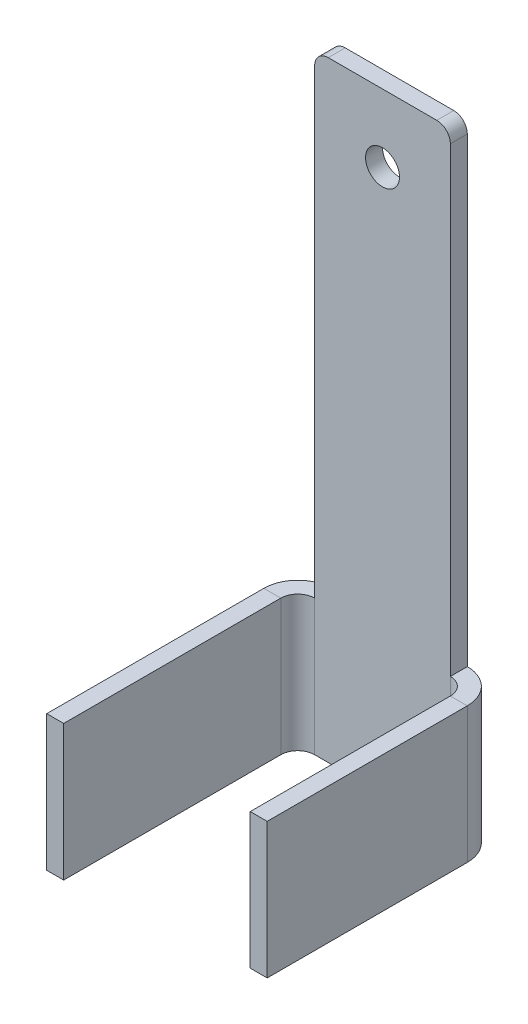
ISO-10303-21;
HEADER;
FILE_DESCRIPTION(('STEP AP214'),'2;1');
FILE_NAME('part.step','',(''),(''),'','','');
FILE_SCHEMA(('AUTOMOTIVE_DESIGN { 1 0 10303 214 1 1 1 1 }'));
ENDSEC;
DATA;
#1=APPLICATION_CONTEXT('core data for automotive mechanical design processes');
#2=APPLICATION_PROTOCOL_DEFINITION('international standard','automotive_design',2000,#1);
#3=PRODUCT_CONTEXT('',#1,'mechanical');
#4=PRODUCT('Part','Part','',(#3));
#5=PRODUCT_RELATED_PRODUCT_CATEGORY('part','',(#4));
#6=PRODUCT_DEFINITION_FORMATION('','',#4);
#7=PRODUCT_DEFINITION_CONTEXT('part definition',#1,'design');
#8=PRODUCT_DEFINITION('design','',#6,#7);
#9=PRODUCT_DEFINITION_SHAPE('','',#8);
#10=(LENGTH_UNIT() NAMED_UNIT(*) SI_UNIT(.MILLI.,.METRE.));
#11=(NAMED_UNIT(*) PLANE_ANGLE_UNIT() SI_UNIT($,.RADIAN.));
#12=(NAMED_UNIT(*) SI_UNIT($,.STERADIAN.) SOLID_ANGLE_UNIT());
#13=UNCERTAINTY_MEASURE_WITH_UNIT(LENGTH_MEASURE(1.E-05),#10,'distance_accuracy_value','');
#14=(GEOMETRIC_REPRESENTATION_CONTEXT(3) GLOBAL_UNCERTAINTY_ASSIGNED_CONTEXT((#13)) GLOBAL_UNIT_ASSIGNED_CONTEXT((#10,
#11,#12)) REPRESENTATION_CONTEXT('',''));
#15=CARTESIAN_POINT('',(0.,0.,0.));
#16=DIRECTION('',(0.,0.,1.));
#17=DIRECTION('',(1.,0.,0.));
#18=AXIS2_PLACEMENT_3D('',#15,#16,#17);
#19=CARTESIAN_POINT('',(12.7,12.7,6.35));
#20=DIRECTION('',(0.,-1.,0.));
#21=DIRECTION('',(0.,0.,-1.));
#22=AXIS2_PLACEMENT_3D('',#19,#20,#21);
#23=PLANE('',#22);
#24=DIRECTION('',(0.,0.,-1.));
#25=VECTOR('',#24,1.);
#26=CARTESIAN_POINT('',(12.7,12.7,0.));
#27=LINE('',#26,#25);
#28=CARTESIAN_POINT('',(12.7,12.7,3.175));
#29=VERTEX_POINT('',#28);
#30=CARTESIAN_POINT('',(12.7,12.7,0.));
#31=VERTEX_POINT('',#30);
#32=EDGE_CURVE('E162',#29,#31,#27,.T.);
#33=ORIENTED_EDGE('',*,*,#32,.F.);
#34=CARTESIAN_POINT('',(12.7,12.7,6.35));
#35=DIRECTION('',(0.,-1.,0.));
#36=DIRECTION('',(0.,0.,-1.));
#37=AXIS2_PLACEMENT_3D('',#34,#35,#36);
#38=CIRCLE('',#37,3.175);
#39=CARTESIAN_POINT('',(15.875,12.7,6.35));
#40=VERTEX_POINT('',#39);
#41=EDGE_CURVE('E227',#29,#40,#38,.T.);
#42=ORIENTED_EDGE('',*,*,#41,.T.);
#43=DIRECTION('',(1.,0.,0.));
#44=VECTOR('',#43,1.);
#45=CARTESIAN_POINT('',(19.05,12.7,6.35));
#46=LINE('',#45,#44);
#47=CARTESIAN_POINT('',(19.05,12.7,6.35));
#48=VERTEX_POINT('',#47);
#49=EDGE_CURVE('E170',#40,#48,#46,.T.);
#50=ORIENTED_EDGE('',*,*,#49,.T.);
#51=CARTESIAN_POINT('',(12.7,12.7,6.35));
#52=DIRECTION('',(0.,1.,0.));
#53=DIRECTION('',(0.,0.,1.));
#54=AXIS2_PLACEMENT_3D('',#51,#52,#53);
#55=CIRCLE('',#54,6.35);
#56=EDGE_CURVE('E173',#31,#48,#55,.F.);
#57=ORIENTED_EDGE('',*,*,#56,.F.);
#58=EDGE_LOOP('',(#33,#42,#50,#57));
#59=FACE_BOUND('',#58,.T.);
#60=ADVANCED_FACE('F36',(#59),#23,.F.);
#61=CARTESIAN_POINT('',(19.05,12.7,3.175));
#62=DIRECTION('',(0.,1.,0.));
#63=DIRECTION('',(0.,0.,-1.));
#64=AXIS2_PLACEMENT_3D('',#61,#62,#63);
#65=PLANE('',#64);
#66=ORIENTED_EDGE('',*,*,#49,.F.);
#67=DIRECTION('',(0.,0.,1.));
#68=VECTOR('',#67,1.);
#69=CARTESIAN_POINT('',(15.875,12.7,3.175));
#70=LINE('',#69,#68);
#71=CARTESIAN_POINT('',(15.875,12.7,43.815));
#72=VERTEX_POINT('',#71);
#73=EDGE_CURVE('E233',#72,#40,#70,.F.);
#74=ORIENTED_EDGE('',*,*,#73,.F.);
#75=DIRECTION('',(1.,0.,0.));
#76=VECTOR('',#75,1.);
#77=CARTESIAN_POINT('',(19.05,12.7,43.815));
#78=LINE('',#77,#76);
#79=CARTESIAN_POINT('',(19.05,12.7,43.815));
#80=VERTEX_POINT('',#79);
#81=EDGE_CURVE('E252',#72,#80,#78,.T.);
#82=ORIENTED_EDGE('',*,*,#81,.T.);
#83=DIRECTION('',(0.,0.,-1.));
#84=VECTOR('',#83,1.);
#85=CARTESIAN_POINT('',(19.05,12.7,3.175));
#86=LINE('',#85,#84);
#87=EDGE_CURVE('E361',#80,#48,#86,.T.);
#88=ORIENTED_EDGE('',*,*,#87,.T.);
#89=EDGE_LOOP('',(#66,#74,#82,#88));
#90=FACE_BOUND('',#89,.T.);
#91=ADVANCED_FACE('F294',(#90),#65,.T.);
#92=CARTESIAN_POINT('',(19.05,-12.7,43.815));
#93=DIRECTION('',(0.,0.,-1.));
#94=DIRECTION('',(0.,-1.,0.));
#95=AXIS2_PLACEMENT_3D('',#92,#93,#94);
#96=PLANE('',#95);
#97=ORIENTED_EDGE('',*,*,#81,.F.);
#98=DIRECTION('',(0.,1.,0.));
#99=VECTOR('',#98,1.);
#100=CARTESIAN_POINT('',(15.875,-12.7,43.815));
#101=LINE('',#100,#99);
#102=CARTESIAN_POINT('',(15.875,-12.7,43.815));
#103=VERTEX_POINT('',#102);
#104=EDGE_CURVE('E230',#72,#103,#101,.F.);
#105=ORIENTED_EDGE('',*,*,#104,.T.);
#106=DIRECTION('',(1.,0.,0.));
#107=VECTOR('',#106,1.);
#108=CARTESIAN_POINT('',(19.05,-12.7,43.815));
#109=LINE('',#108,#107);
#110=CARTESIAN_POINT('',(19.05,-12.7,43.815));
#111=VERTEX_POINT('',#110);
#112=EDGE_CURVE('E250',#103,#111,#109,.T.);
#113=ORIENTED_EDGE('',*,*,#112,.T.);
#114=DIRECTION('',(0.,-1.,0.));
#115=VECTOR('',#114,1.);
#116=CARTESIAN_POINT('',(19.05,-12.7,43.815));
#117=LINE('',#116,#115);
#118=EDGE_CURVE('E359',#80,#111,#117,.T.);
#119=ORIENTED_EDGE('',*,*,#118,.F.);
#120=EDGE_LOOP('',(#97,#105,#113,#119));
#121=FACE_BOUND('',#120,.T.);
#122=ADVANCED_FACE('F299',(#121),#96,.F.);
#123=CARTESIAN_POINT('',(19.05,-12.7,3.175));
#124=DIRECTION('',(0.,1.,0.));
#125=DIRECTION('',(0.,0.,-1.));
#126=AXIS2_PLACEMENT_3D('',#123,#124,#125);
#127=PLANE('',#126);
#128=ORIENTED_EDGE('',*,*,#112,.F.);
#129=DIRECTION('',(0.,0.,1.));
#130=VECTOR('',#129,1.);
#131=CARTESIAN_POINT('',(15.875,-12.7,3.175));
#132=LINE('',#131,#130);
#133=CARTESIAN_POINT('',(15.875,-12.7,6.35));
#134=VERTEX_POINT('',#133);
#135=EDGE_CURVE('E224',#103,#134,#132,.F.);
#136=ORIENTED_EDGE('',*,*,#135,.T.);
#137=DIRECTION('',(1.,0.,0.));
#138=VECTOR('',#137,1.);
#139=CARTESIAN_POINT('',(19.05,-12.7,6.35));
#140=LINE('',#139,#138);
#141=CARTESIAN_POINT('',(19.05,-12.7,6.35));
#142=VERTEX_POINT('',#141);
#143=EDGE_CURVE('E248',#134,#142,#140,.T.);
#144=ORIENTED_EDGE('',*,*,#143,.T.);
#145=DIRECTION('',(0.,0.,-1.));
#146=VECTOR('',#145,1.);
#147=CARTESIAN_POINT('',(19.05,-12.7,3.175));
#148=LINE('',#147,#146);
#149=EDGE_CURVE('E366',#111,#142,#148,.T.);
#150=ORIENTED_EDGE('',*,*,#149,.F.);
#151=EDGE_LOOP('',(#128,#136,#144,#150));
#152=FACE_BOUND('',#151,.T.);
#153=ADVANCED_FACE('F349',(#152),#127,.F.);
#154=CARTESIAN_POINT('',(12.7,-12.7,6.35));
#155=DIRECTION('',(0.,-1.,0.));
#156=DIRECTION('',(0.,0.,-1.));
#157=AXIS2_PLACEMENT_3D('',#154,#155,#156);
#158=PLANE('',#157);
#159=ORIENTED_EDGE('',*,*,#143,.F.);
#160=CARTESIAN_POINT('',(12.7,-12.7,6.35));
#161=DIRECTION('',(0.,-1.,0.));
#162=DIRECTION('',(0.,0.,-1.));
#163=AXIS2_PLACEMENT_3D('',#160,#161,#162);
#164=CIRCLE('',#163,3.175);
#165=CARTESIAN_POINT('',(12.7,-12.7,3.175));
#166=VERTEX_POINT('',#165);
#167=EDGE_CURVE('E221',#134,#166,#164,.F.);
#168=ORIENTED_EDGE('',*,*,#167,.T.);
#169=DIRECTION('',(0.,0.,-1.));
#170=VECTOR('',#169,1.);
#171=CARTESIAN_POINT('',(12.7,-12.7,0.));
#172=LINE('',#171,#170);
#173=CARTESIAN_POINT('',(12.7,-12.7,0.));
#174=VERTEX_POINT('',#173);
#175=EDGE_CURVE('E246',#166,#174,#172,.T.);
#176=ORIENTED_EDGE('',*,*,#175,.T.);
#177=CARTESIAN_POINT('',(12.7,-12.7,6.35));
#178=DIRECTION('',(0.,1.,0.));
#179=DIRECTION('',(0.,0.,1.));
#180=AXIS2_PLACEMENT_3D('',#177,#178,#179);
#181=CIRCLE('',#180,6.35);
#182=EDGE_CURVE('E177',#142,#174,#181,.T.);
#183=ORIENTED_EDGE('',*,*,#182,.F.);
#184=EDGE_LOOP('',(#159,#168,#176,#183));
#185=FACE_BOUND('',#184,.T.);
#186=ADVANCED_FACE('F343',(#185),#158,.T.);
#187=CARTESIAN_POINT('',(-19.05,-12.7,0.));
#188=DIRECTION('',(0.,1.,0.));
#189=DIRECTION('',(1.,0.,0.));
#190=AXIS2_PLACEMENT_3D('',#187,#188,#189);
#191=PLANE('',#190);
#192=ORIENTED_EDGE('',*,*,#175,.F.);
#193=DIRECTION('',(-1.,0.,0.));
#194=VECTOR('',#193,1.);
#195=CARTESIAN_POINT('',(0.,-12.7,3.175));
#196=LINE('',#195,#194);
#197=CARTESIAN_POINT('',(-12.7,-12.7,3.175));
#198=VERTEX_POINT('',#197);
#199=EDGE_CURVE('E216',#198,#166,#196,.F.);
#200=ORIENTED_EDGE('',*,*,#199,.F.);
#201=DIRECTION('',(0.,0.,-1.));
#202=VECTOR('',#201,1.);
#203=CARTESIAN_POINT('',(-12.7,-12.7,0.));
#204=LINE('',#203,#202);
#205=CARTESIAN_POINT('',(-12.7,-12.7,0.));
#206=VERTEX_POINT('',#205);
#207=EDGE_CURVE('E244',#198,#206,#204,.T.);
#208=ORIENTED_EDGE('',*,*,#207,.T.);
#209=DIRECTION('',(1.,0.,0.));
#210=VECTOR('',#209,1.);
#211=CARTESIAN_POINT('',(-19.05,-12.7,0.));
#212=LINE('',#211,#210);
#213=EDGE_CURVE('E373',#206,#174,#212,.T.);
#214=ORIENTED_EDGE('',*,*,#213,.T.);
#215=EDGE_LOOP('',(#192,#200,#208,#214));
#216=FACE_BOUND('',#215,.T.);
#217=ADVANCED_FACE('F339',(#216),#191,.F.);
#218=CARTESIAN_POINT('',(-12.7,-12.7,6.35));
#219=DIRECTION('',(0.,1.,0.));
#220=DIRECTION('',(0.,0.,1.));
#221=AXIS2_PLACEMENT_3D('',#218,#219,#220);
#222=PLANE('',#221);
#223=ORIENTED_EDGE('',*,*,#207,.F.);
#224=CARTESIAN_POINT('',(-12.7,-12.7,6.35));
#225=DIRECTION('',(0.,1.,0.));
#226=DIRECTION('',(0.,0.,1.));
#227=AXIS2_PLACEMENT_3D('',#224,#225,#226);
#228=CIRCLE('',#227,3.175);
#229=CARTESIAN_POINT('',(-15.875,-12.7,6.35));
#230=VERTEX_POINT('',#229);
#231=EDGE_CURVE('E217',#198,#230,#228,.T.);
#232=ORIENTED_EDGE('',*,*,#231,.T.);
#233=DIRECTION('',(-1.,0.,0.));
#234=VECTOR('',#233,1.);
#235=CARTESIAN_POINT('',(-19.05,-12.7,6.35));
#236=LINE('',#235,#234);
#237=CARTESIAN_POINT('',(-19.05,-12.7,6.35));
#238=VERTEX_POINT('',#237);
#239=EDGE_CURVE('E242',#230,#238,#236,.T.);
#240=ORIENTED_EDGE('',*,*,#239,.T.);
#241=CARTESIAN_POINT('',(-12.7,-12.7,6.35));
#242=DIRECTION('',(0.,-1.,0.));
#243=DIRECTION('',(0.,0.,-1.));
#244=AXIS2_PLACEMENT_3D('',#241,#242,#243);
#245=CIRCLE('',#244,6.35);
#246=EDGE_CURVE('E195',#206,#238,#245,.F.);
#247=ORIENTED_EDGE('',*,*,#246,.F.);
#248=EDGE_LOOP('',(#223,#232,#240,#247));
#249=FACE_BOUND('',#248,.T.);
#250=ADVANCED_FACE('F334',(#249),#222,.F.);
#251=CARTESIAN_POINT('',(-19.05,-12.7,3.175));
#252=DIRECTION('',(0.,-1.,0.));
#253=DIRECTION('',(0.,0.,-1.));
#254=AXIS2_PLACEMENT_3D('',#251,#252,#253);
#255=PLANE('',#254);
#256=ORIENTED_EDGE('',*,*,#239,.F.);
#257=DIRECTION('',(0.,0.,-1.));
#258=VECTOR('',#257,1.);
#259=CARTESIAN_POINT('',(-15.875,-12.7,3.175));
#260=LINE('',#259,#258);
#261=CARTESIAN_POINT('',(-15.875,-12.7,46.99));
#262=VERTEX_POINT('',#261);
#263=EDGE_CURVE('E213',#262,#230,#260,.T.);
#264=ORIENTED_EDGE('',*,*,#263,.F.);
#265=DIRECTION('',(-1.,0.,0.));
#266=VECTOR('',#265,1.);
#267=CARTESIAN_POINT('',(-19.05,-12.7,46.99));
#268=LINE('',#267,#266);
#269=CARTESIAN_POINT('',(-19.05,-12.7,46.99));
#270=VERTEX_POINT('',#269);
#271=EDGE_CURVE('E240',#262,#270,#268,.T.);
#272=ORIENTED_EDGE('',*,*,#271,.T.);
#273=DIRECTION('',(0.,0.,-1.));
#274=VECTOR('',#273,1.);
#275=CARTESIAN_POINT('',(-19.05,-12.7,3.175));
#276=LINE('',#275,#274);
#277=EDGE_CURVE('E375',#270,#238,#276,.T.);
#278=ORIENTED_EDGE('',*,*,#277,.T.);
#279=EDGE_LOOP('',(#256,#264,#272,#278));
#280=FACE_BOUND('',#279,.T.);
#281=ADVANCED_FACE('F394',(#280),#255,.T.);
#282=CARTESIAN_POINT('',(-19.05,-12.7,46.99));
#283=DIRECTION('',(0.,0.,-1.));
#284=DIRECTION('',(0.,1.,0.));
#285=AXIS2_PLACEMENT_3D('',#282,#283,#284);
#286=PLANE('',#285);
#287=ORIENTED_EDGE('',*,*,#271,.F.);
#288=DIRECTION('',(0.,1.,0.));
#289=VECTOR('',#288,1.);
#290=CARTESIAN_POINT('',(-15.875,-12.7,46.99));
#291=LINE('',#290,#289);
#292=CARTESIAN_POINT('',(-15.875,12.7,46.99));
#293=VERTEX_POINT('',#292);
#294=EDGE_CURVE('E210',#262,#293,#291,.T.);
#295=ORIENTED_EDGE('',*,*,#294,.T.);
#296=DIRECTION('',(-1.,0.,0.));
#297=VECTOR('',#296,1.);
#298=CARTESIAN_POINT('',(-19.05,12.7,46.99));
#299=LINE('',#298,#297);
#300=CARTESIAN_POINT('',(-19.05,12.7,46.99));
#301=VERTEX_POINT('',#300);
#302=EDGE_CURVE('E187',#293,#301,#299,.T.);
#303=ORIENTED_EDGE('',*,*,#302,.T.);
#304=DIRECTION('',(0.,1.,0.));
#305=VECTOR('',#304,1.);
#306=CARTESIAN_POINT('',(-19.05,-12.7,46.99));
#307=LINE('',#306,#305);
#308=EDGE_CURVE('E378',#270,#301,#307,.T.);
#309=ORIENTED_EDGE('',*,*,#308,.F.);
#310=EDGE_LOOP('',(#287,#295,#303,#309));
#311=FACE_BOUND('',#310,.T.);
#312=ADVANCED_FACE('F314',(#311),#286,.F.);
#313=CARTESIAN_POINT('',(-19.05,12.7,3.175));
#314=DIRECTION('',(0.,-1.,0.));
#315=DIRECTION('',(0.,0.,-1.));
#316=AXIS2_PLACEMENT_3D('',#313,#314,#315);
#317=PLANE('',#316);
#318=ORIENTED_EDGE('',*,*,#302,.F.);
#319=DIRECTION('',(0.,0.,-1.));
#320=VECTOR('',#319,1.);
#321=CARTESIAN_POINT('',(-15.875,12.7,3.175));
#322=LINE('',#321,#320);
#323=CARTESIAN_POINT('',(-15.875,12.7,6.35));
#324=VERTEX_POINT('',#323);
#325=EDGE_CURVE('E200',#293,#324,#322,.T.);
#326=ORIENTED_EDGE('',*,*,#325,.T.);
#327=DIRECTION('',(-1.,0.,0.));
#328=VECTOR('',#327,1.);
#329=CARTESIAN_POINT('',(-19.05,12.7,6.35));
#330=LINE('',#329,#328);
#331=CARTESIAN_POINT('',(-19.05,12.7,6.35));
#332=VERTEX_POINT('',#331);
#333=EDGE_CURVE('E184',#324,#332,#330,.T.);
#334=ORIENTED_EDGE('',*,*,#333,.T.);
#335=DIRECTION('',(0.,0.,-1.));
#336=VECTOR('',#335,1.);
#337=CARTESIAN_POINT('',(-19.05,12.7,3.175));
#338=LINE('',#337,#336);
#339=EDGE_CURVE('E381',#301,#332,#338,.T.);
#340=ORIENTED_EDGE('',*,*,#339,.F.);
#341=EDGE_LOOP('',(#318,#326,#334,#340));
#342=FACE_BOUND('',#341,.T.);
#343=ADVANCED_FACE('F306',(#342),#317,.F.);
#344=CARTESIAN_POINT('',(-12.7,12.7,6.35));
#345=DIRECTION('',(0.,1.,0.));
#346=DIRECTION('',(0.,0.,1.));
#347=AXIS2_PLACEMENT_3D('',#344,#345,#346);
#348=PLANE('',#347);
#349=CARTESIAN_POINT('',(-12.7,12.7,6.35));
#350=DIRECTION('',(0.,1.,0.));
#351=DIRECTION('',(0.,0.,1.));
#352=AXIS2_PLACEMENT_3D('',#349,#350,#351);
#353=CIRCLE('',#352,3.175);
#354=CARTESIAN_POINT('',(-12.7,12.7,3.175));
#355=VERTEX_POINT('',#354);
#356=EDGE_CURVE('E220',#324,#355,#353,.F.);
#357=ORIENTED_EDGE('',*,*,#356,.T.);
#358=DIRECTION('',(0.,0.,-1.));
#359=VECTOR('',#358,1.);
#360=CARTESIAN_POINT('',(-12.7,12.7,0.));
#361=LINE('',#360,#359);
#362=CARTESIAN_POINT('',(-12.7,12.7,0.));
#363=VERTEX_POINT('',#362);
#364=EDGE_CURVE('E169',#355,#363,#361,.T.);
#365=ORIENTED_EDGE('',*,*,#364,.T.);
#366=CARTESIAN_POINT('',(-12.7,12.7,6.35));
#367=DIRECTION('',(0.,-1.,0.));
#368=DIRECTION('',(0.,0.,-1.));
#369=AXIS2_PLACEMENT_3D('',#366,#367,#368);
#370=CIRCLE('',#369,6.35);
#371=EDGE_CURVE('E364',#332,#363,#370,.T.);
#372=ORIENTED_EDGE('',*,*,#371,.F.);
#373=ORIENTED_EDGE('',*,*,#333,.F.);
#374=EDGE_LOOP('',(#357,#365,#372,#373));
#375=FACE_BOUND('',#374,.T.);
#376=ADVANCED_FACE('F303',(#375),#348,.T.);
#377=CARTESIAN_POINT('',(-19.05,-12.7,3.175));
#378=DIRECTION('',(1.,0.,0.));
#379=DIRECTION('',(0.,0.,-1.));
#380=AXIS2_PLACEMENT_3D('',#377,#378,#379);
#381=PLANE('',#380);
#382=ORIENTED_EDGE('',*,*,#339,.T.);
#383=DIRECTION('',(0.,-1.,0.));
#384=VECTOR('',#383,1.);
#385=CARTESIAN_POINT('',(-19.05,-12.7,6.35));
#386=LINE('',#385,#384);
#387=EDGE_CURVE('E384',#332,#238,#386,.T.);
#388=ORIENTED_EDGE('',*,*,#387,.T.);
#389=ORIENTED_EDGE('',*,*,#277,.F.);
#390=ORIENTED_EDGE('',*,*,#308,.T.);
#391=EDGE_LOOP('',(#382,#388,#389,#390));
#392=FACE_BOUND('',#391,.T.);
#393=ADVANCED_FACE('F305',(#392),#381,.F.);
#394=CARTESIAN_POINT('',(0.,0.,0.));
#395=DIRECTION('',(0.,0.,-1.));
#396=DIRECTION('',(-1.,0.,0.));
#397=AXIS2_PLACEMENT_3D('',#394,#395,#396);
#398=PLANE('',#397);
#399=CARTESIAN_POINT('',(0.,88.9,0.));
#400=DIRECTION('',(0.,0.,-1.));
#401=DIRECTION('',(-1.,0.,0.));
#402=AXIS2_PLACEMENT_3D('',#399,#400,#401);
#403=CIRCLE('',#402,3.175);
#404=CARTESIAN_POINT('',(-3.175,88.9,0.));
#405=VERTEX_POINT('',#404);
#406=EDGE_CURVE('E260',#405,#405,#403,.T.);
#407=ORIENTED_EDGE('',*,*,#406,.F.);
#408=EDGE_LOOP('',(#407));
#409=FACE_BOUND('',#408,.T.);
#410=DIRECTION('',(1.,0.,0.));
#411=VECTOR('',#410,1.);
#412=CARTESIAN_POINT('',(12.7,101.6,0.));
#413=LINE('',#412,#411);
#414=CARTESIAN_POINT('',(-10.16,101.6,0.));
#415=VERTEX_POINT('',#414);
#416=CARTESIAN_POINT('',(10.16,101.6,0.));
#417=VERTEX_POINT('',#416);
#418=EDGE_CURVE('E369',#415,#417,#413,.T.);
#419=ORIENTED_EDGE('',*,*,#418,.T.);
#420=CARTESIAN_POINT('',(10.16,99.06,0.));
#421=DIRECTION('',(0.,0.,-1.));
#422=DIRECTION('',(-1.,0.,0.));
#423=AXIS2_PLACEMENT_3D('',#420,#421,#422);
#424=CIRCLE('',#423,2.54);
#425=CARTESIAN_POINT('',(12.7,99.06,0.));
#426=VERTEX_POINT('',#425);
#427=EDGE_CURVE('E157',#417,#426,#424,.T.);
#428=ORIENTED_EDGE('',*,*,#427,.T.);
#429=DIRECTION('',(0.,-1.,0.));
#430=VECTOR('',#429,1.);
#431=CARTESIAN_POINT('',(12.7,12.7,0.));
#432=LINE('',#431,#430);
#433=EDGE_CURVE('E150',#426,#31,#432,.T.);
#434=ORIENTED_EDGE('',*,*,#433,.T.);
#435=DIRECTION('',(0.,1.,0.));
#436=VECTOR('',#435,1.);
#437=CARTESIAN_POINT('',(12.7,-12.7,0.));
#438=LINE('',#437,#436);
#439=EDGE_CURVE('E156',#31,#174,#438,.F.);
#440=ORIENTED_EDGE('',*,*,#439,.T.);
#441=ORIENTED_EDGE('',*,*,#213,.F.);
#442=DIRECTION('',(0.,-1.,0.));
#443=VECTOR('',#442,1.);
#444=CARTESIAN_POINT('',(-12.7,12.7,0.));
#445=LINE('',#444,#443);
#446=EDGE_CURVE('E190',#206,#363,#445,.F.);
#447=ORIENTED_EDGE('',*,*,#446,.T.);
#448=DIRECTION('',(0.,1.,0.));
#449=VECTOR('',#448,1.);
#450=CARTESIAN_POINT('',(-12.7,12.7,0.));
#451=LINE('',#450,#449);
#452=CARTESIAN_POINT('',(-12.7,99.06,0.));
#453=VERTEX_POINT('',#452);
#454=EDGE_CURVE('E158',#363,#453,#451,.T.);
#455=ORIENTED_EDGE('',*,*,#454,.T.);
#456=CARTESIAN_POINT('',(-10.16,99.06,0.));
#457=DIRECTION('',(0.,0.,-1.));
#458=DIRECTION('',(-1.,0.,0.));
#459=AXIS2_PLACEMENT_3D('',#456,#457,#458);
#460=CIRCLE('',#459,2.54);
#461=EDGE_CURVE('E265',#453,#415,#460,.T.);
#462=ORIENTED_EDGE('',*,*,#461,.T.);
#463=EDGE_LOOP('',(#419,#428,#434,#440,#441,#447,#455,#462));
#464=FACE_BOUND('',#463,.T.);
#465=ADVANCED_FACE('F153',(#409,#464),#398,.T.);
#466=CARTESIAN_POINT('',(19.05,-12.7,3.175));
#467=DIRECTION('',(-1.,0.,0.));
#468=DIRECTION('',(0.,0.,1.));
#469=AXIS2_PLACEMENT_3D('',#466,#467,#468);
#470=PLANE('',#469);
#471=ORIENTED_EDGE('',*,*,#149,.T.);
#472=DIRECTION('',(0.,1.,0.));
#473=VECTOR('',#472,1.);
#474=CARTESIAN_POINT('',(19.05,12.7,6.35));
#475=LINE('',#474,#473);
#476=EDGE_CURVE('E185',#142,#48,#475,.T.);
#477=ORIENTED_EDGE('',*,*,#476,.T.);
#478=ORIENTED_EDGE('',*,*,#87,.F.);
#479=ORIENTED_EDGE('',*,*,#118,.T.);
#480=EDGE_LOOP('',(#471,#477,#478,#479));
#481=FACE_BOUND('',#480,.T.);
#482=ADVANCED_FACE('F363',(#481),#470,.F.);
#483=CARTESIAN_POINT('',(-12.7,-12.7,6.35));
#484=DIRECTION('',(0.,1.,0.));
#485=DIRECTION('',(0.,0.,1.));
#486=AXIS2_PLACEMENT_3D('',#483,#484,#485);
#487=CYLINDRICAL_SURFACE('',#486,6.35);
#488=ORIENTED_EDGE('',*,*,#371,.T.);
#489=ORIENTED_EDGE('',*,*,#446,.F.);
#490=ORIENTED_EDGE('',*,*,#246,.T.);
#491=ORIENTED_EDGE('',*,*,#387,.F.);
#492=EDGE_LOOP('',(#488,#489,#490,#491));
#493=FACE_BOUND('',#492,.T.);
#494=ADVANCED_FACE('F392',(#493),#487,.T.);
#495=CARTESIAN_POINT('',(12.7,-12.7,6.35));
#496=DIRECTION('',(0.,-1.,0.));
#497=DIRECTION('',(0.,0.,-1.));
#498=AXIS2_PLACEMENT_3D('',#495,#496,#497);
#499=CYLINDRICAL_SURFACE('',#498,6.35);
#500=ORIENTED_EDGE('',*,*,#182,.T.);
#501=ORIENTED_EDGE('',*,*,#439,.F.);
#502=ORIENTED_EDGE('',*,*,#56,.T.);
#503=ORIENTED_EDGE('',*,*,#476,.F.);
#504=EDGE_LOOP('',(#500,#501,#502,#503));
#505=FACE_BOUND('',#504,.T.);
#506=ADVANCED_FACE('F181',(#505),#499,.T.);
#507=CARTESIAN_POINT('',(-15.875,-12.7,3.175));
#508=DIRECTION('',(1.,0.,0.));
#509=DIRECTION('',(0.,0.,-1.));
#510=AXIS2_PLACEMENT_3D('',#507,#508,#509);
#511=PLANE('',#510);
#512=ORIENTED_EDGE('',*,*,#325,.F.);
#513=ORIENTED_EDGE('',*,*,#294,.F.);
#514=ORIENTED_EDGE('',*,*,#263,.T.);
#515=DIRECTION('',(0.,1.,0.));
#516=VECTOR('',#515,1.);
#517=CARTESIAN_POINT('',(-15.875,-12.7,6.35));
#518=LINE('',#517,#516);
#519=EDGE_CURVE('E196',#324,#230,#518,.F.);
#520=ORIENTED_EDGE('',*,*,#519,.F.);
#521=EDGE_LOOP('',(#512,#513,#514,#520));
#522=FACE_BOUND('',#521,.T.);
#523=ADVANCED_FACE('F330',(#522),#511,.T.);
#524=CARTESIAN_POINT('',(0.,0.,3.175));
#525=DIRECTION('',(0.,0.,-1.));
#526=DIRECTION('',(-1.,0.,0.));
#527=AXIS2_PLACEMENT_3D('',#524,#525,#526);
#528=PLANE('',#527);
#529=CARTESIAN_POINT('',(0.,88.9,3.175));
#530=DIRECTION('',(0.,0.,-1.));
#531=DIRECTION('',(-1.,0.,0.));
#532=AXIS2_PLACEMENT_3D('',#529,#530,#531);
#533=CIRCLE('',#532,3.175);
#534=CARTESIAN_POINT('',(-3.175,88.9,3.175));
#535=VERTEX_POINT('',#534);
#536=EDGE_CURVE('E159',#535,#535,#533,.T.);
#537=ORIENTED_EDGE('',*,*,#536,.T.);
#538=EDGE_LOOP('',(#537));
#539=FACE_BOUND('',#538,.T.);
#540=DIRECTION('',(0.,1.,0.));
#541=VECTOR('',#540,1.);
#542=CARTESIAN_POINT('',(12.7,12.7,3.175));
#543=LINE('',#542,#541);
#544=CARTESIAN_POINT('',(12.7,99.06,3.175));
#545=VERTEX_POINT('',#544);
#546=EDGE_CURVE('E165',#29,#545,#543,.T.);
#547=ORIENTED_EDGE('',*,*,#546,.T.);
#548=CARTESIAN_POINT('',(10.16,99.06,3.175));
#549=DIRECTION('',(0.,0.,-1.));
#550=DIRECTION('',(-1.,0.,0.));
#551=AXIS2_PLACEMENT_3D('',#548,#549,#550);
#552=CIRCLE('',#551,2.54);
#553=CARTESIAN_POINT('',(10.16,101.6,3.175));
#554=VERTEX_POINT('',#553);
#555=EDGE_CURVE('E44',#545,#554,#552,.F.);
#556=ORIENTED_EDGE('',*,*,#555,.T.);
#557=DIRECTION('',(-1.,0.,0.));
#558=VECTOR('',#557,1.);
#559=CARTESIAN_POINT('',(12.7,101.6,3.175));
#560=LINE('',#559,#558);
#561=CARTESIAN_POINT('',(-10.16,101.6,3.175));
#562=VERTEX_POINT('',#561);
#563=EDGE_CURVE('E272',#554,#562,#560,.T.);
#564=ORIENTED_EDGE('',*,*,#563,.T.);
#565=CARTESIAN_POINT('',(-10.16,99.06,3.175));
#566=DIRECTION('',(0.,0.,-1.));
#567=DIRECTION('',(-1.,0.,0.));
#568=AXIS2_PLACEMENT_3D('',#565,#566,#567);
#569=CIRCLE('',#568,2.54);
#570=CARTESIAN_POINT('',(-12.7,99.06,3.175));
#571=VERTEX_POINT('',#570);
#572=EDGE_CURVE('E51',#562,#571,#569,.F.);
#573=ORIENTED_EDGE('',*,*,#572,.T.);
#574=DIRECTION('',(0.,-1.,0.));
#575=VECTOR('',#574,1.);
#576=CARTESIAN_POINT('',(-12.7,12.7,3.175));
#577=LINE('',#576,#575);
#578=EDGE_CURVE('E279',#571,#355,#577,.T.);
#579=ORIENTED_EDGE('',*,*,#578,.T.);
#580=DIRECTION('',(0.,1.,0.));
#581=VECTOR('',#580,1.);
#582=CARTESIAN_POINT('',(-12.7,0.,3.175));
#583=LINE('',#582,#581);
#584=EDGE_CURVE('E199',#198,#355,#583,.T.);
#585=ORIENTED_EDGE('',*,*,#584,.F.);
#586=ORIENTED_EDGE('',*,*,#199,.T.);
#587=DIRECTION('',(0.,1.,0.));
#588=VECTOR('',#587,1.);
#589=CARTESIAN_POINT('',(12.7,0.,3.175));
#590=LINE('',#589,#588);
#591=EDGE_CURVE('E178',#29,#166,#590,.F.);
#592=ORIENTED_EDGE('',*,*,#591,.F.);
#593=EDGE_LOOP('',(#547,#556,#564,#573,#579,#585,#586,#592));
#594=FACE_BOUND('',#593,.T.);
#595=ADVANCED_FACE('F271',(#539,#594),#528,.F.);
#596=CARTESIAN_POINT('',(15.875,-12.7,3.175));
#597=DIRECTION('',(-1.,0.,0.));
#598=DIRECTION('',(0.,0.,1.));
#599=AXIS2_PLACEMENT_3D('',#596,#597,#598);
#600=PLANE('',#599);
#601=ORIENTED_EDGE('',*,*,#135,.F.);
#602=ORIENTED_EDGE('',*,*,#104,.F.);
#603=ORIENTED_EDGE('',*,*,#73,.T.);
#604=DIRECTION('',(0.,1.,0.));
#605=VECTOR('',#604,1.);
#606=CARTESIAN_POINT('',(15.875,-12.7,6.35));
#607=LINE('',#606,#605);
#608=EDGE_CURVE('E203',#134,#40,#607,.T.);
#609=ORIENTED_EDGE('',*,*,#608,.F.);
#610=EDGE_LOOP('',(#601,#602,#603,#609));
#611=FACE_BOUND('',#610,.T.);
#612=ADVANCED_FACE('F354',(#611),#600,.T.);
#613=CARTESIAN_POINT('',(-12.7,-12.7,6.35));
#614=DIRECTION('',(0.,1.,0.));
#615=DIRECTION('',(0.,0.,1.));
#616=AXIS2_PLACEMENT_3D('',#613,#614,#615);
#617=CYLINDRICAL_SURFACE('',#616,3.175);
#618=ORIENTED_EDGE('',*,*,#356,.F.);
#619=ORIENTED_EDGE('',*,*,#519,.T.);
#620=ORIENTED_EDGE('',*,*,#231,.F.);
#621=ORIENTED_EDGE('',*,*,#584,.T.);
#622=EDGE_LOOP('',(#618,#619,#620,#621));
#623=FACE_BOUND('',#622,.T.);
#624=ADVANCED_FACE('F323',(#623),#617,.F.);
#625=CARTESIAN_POINT('',(12.7,-12.7,6.35));
#626=DIRECTION('',(0.,-1.,0.));
#627=DIRECTION('',(0.,0.,-1.));
#628=AXIS2_PLACEMENT_3D('',#625,#626,#627);
#629=CYLINDRICAL_SURFACE('',#628,3.175);
#630=ORIENTED_EDGE('',*,*,#167,.F.);
#631=ORIENTED_EDGE('',*,*,#608,.T.);
#632=ORIENTED_EDGE('',*,*,#41,.F.);
#633=ORIENTED_EDGE('',*,*,#591,.T.);
#634=EDGE_LOOP('',(#630,#631,#632,#633));
#635=FACE_BOUND('',#634,.T.);
#636=ADVANCED_FACE('F346',(#635),#629,.F.);
#637=CARTESIAN_POINT('',(12.7,12.7,95.6323955938626));
#638=DIRECTION('',(1.,0.,0.));
#639=DIRECTION('',(0.,0.,-1.));
#640=AXIS2_PLACEMENT_3D('',#637,#638,#639);
#641=PLANE('',#640);
#642=ORIENTED_EDGE('',*,*,#433,.F.);
#643=DIRECTION('',(0.,0.,-1.));
#644=VECTOR('',#643,1.);
#645=CARTESIAN_POINT('',(12.7,99.06,95.6323955938626));
#646=LINE('',#645,#644);
#647=EDGE_CURVE('E59',#426,#545,#646,.F.);
#648=ORIENTED_EDGE('',*,*,#647,.T.);
#649=ORIENTED_EDGE('',*,*,#546,.F.);
#650=ORIENTED_EDGE('',*,*,#32,.T.);
#651=EDGE_LOOP('',(#642,#648,#649,#650));
#652=FACE_BOUND('',#651,.T.);
#653=ADVANCED_FACE('F164',(#652),#641,.T.);
#654=CARTESIAN_POINT('',(12.7,101.6,95.6323955938626));
#655=DIRECTION('',(0.,1.,0.));
#656=DIRECTION('',(0.,0.,1.));
#657=AXIS2_PLACEMENT_3D('',#654,#655,#656);
#658=PLANE('',#657);
#659=ORIENTED_EDGE('',*,*,#563,.F.);
#660=DIRECTION('',(0.,0.,-1.));
#661=VECTOR('',#660,1.);
#662=CARTESIAN_POINT('',(10.16,101.6,95.6323955938626));
#663=LINE('',#662,#661);
#664=EDGE_CURVE('E262',#554,#417,#663,.T.);
#665=ORIENTED_EDGE('',*,*,#664,.T.);
#666=ORIENTED_EDGE('',*,*,#418,.F.);
#667=DIRECTION('',(0.,0.,-1.));
#668=VECTOR('',#667,1.);
#669=CARTESIAN_POINT('',(-10.16,101.6,95.6323955938626));
#670=LINE('',#669,#668);
#671=EDGE_CURVE('E256',#415,#562,#670,.F.);
#672=ORIENTED_EDGE('',*,*,#671,.T.);
#673=EDGE_LOOP('',(#659,#665,#666,#672));
#674=FACE_BOUND('',#673,.T.);
#675=ADVANCED_FACE('F276',(#674),#658,.T.);
#676=CARTESIAN_POINT('',(-12.7,12.7,95.6323955938626));
#677=DIRECTION('',(-1.,0.,0.));
#678=DIRECTION('',(0.,0.,1.));
#679=AXIS2_PLACEMENT_3D('',#676,#677,#678);
#680=PLANE('',#679);
#681=ORIENTED_EDGE('',*,*,#578,.F.);
#682=DIRECTION('',(0.,0.,-1.));
#683=VECTOR('',#682,1.);
#684=CARTESIAN_POINT('',(-12.7,99.06,95.6323955938626));
#685=LINE('',#684,#683);
#686=EDGE_CURVE('E11',#571,#453,#685,.T.);
#687=ORIENTED_EDGE('',*,*,#686,.T.);
#688=ORIENTED_EDGE('',*,*,#454,.F.);
#689=ORIENTED_EDGE('',*,*,#364,.F.);
#690=EDGE_LOOP('',(#681,#687,#688,#689));
#691=FACE_BOUND('',#690,.T.);
#692=ADVANCED_FACE('F289',(#691),#680,.T.);
#693=CARTESIAN_POINT('',(0.,88.9,46.99));
#694=DIRECTION('',(0.,0.,-1.));
#695=DIRECTION('',(-1.,0.,0.));
#696=AXIS2_PLACEMENT_3D('',#693,#694,#695);
#697=CYLINDRICAL_SURFACE('',#696,3.175);
#698=ORIENTED_EDGE('',*,*,#406,.T.);
#699=EDGE_LOOP('',(#698));
#700=FACE_BOUND('',#699,.T.);
#701=ORIENTED_EDGE('',*,*,#536,.F.);
#702=EDGE_LOOP('',(#701));
#703=FACE_BOUND('',#702,.T.);
#704=ADVANCED_FACE('F283',(#700,#703),#697,.F.);
#705=CARTESIAN_POINT('',(10.16,99.06,95.6323955938626));
#706=DIRECTION('',(0.,0.,-1.));
#707=DIRECTION('',(-1.,0.,0.));
#708=AXIS2_PLACEMENT_3D('',#705,#706,#707);
#709=CYLINDRICAL_SURFACE('',#708,2.54);
#710=ORIENTED_EDGE('',*,*,#555,.F.);
#711=ORIENTED_EDGE('',*,*,#647,.F.);
#712=ORIENTED_EDGE('',*,*,#427,.F.);
#713=ORIENTED_EDGE('',*,*,#664,.F.);
#714=EDGE_LOOP('',(#710,#711,#712,#713));
#715=FACE_BOUND('',#714,.T.);
#716=ADVANCED_FACE('F281',(#715),#709,.T.);
#717=CARTESIAN_POINT('',(-10.16,99.06,95.6323955938626));
#718=DIRECTION('',(0.,0.,-1.));
#719=DIRECTION('',(-1.,0.,0.));
#720=AXIS2_PLACEMENT_3D('',#717,#718,#719);
#721=CYLINDRICAL_SURFACE('',#720,2.54);
#722=ORIENTED_EDGE('',*,*,#572,.F.);
#723=ORIENTED_EDGE('',*,*,#671,.F.);
#724=ORIENTED_EDGE('',*,*,#461,.F.);
#725=ORIENTED_EDGE('',*,*,#686,.F.);
#726=EDGE_LOOP('',(#722,#723,#724,#725));
#727=FACE_BOUND('',#726,.T.);
#728=ADVANCED_FACE('F38',(#727),#721,.T.);
#729=CLOSED_SHELL('',(#60,#91,#122,#153,#186,#217,#250,#281,#312,#343,#376,#393,#465,#482,#494,
#506,#523,#595,#612,#624,#636,#653,#675,#692,#704,#716,#728));
#730=MANIFOLD_SOLID_BREP('B2',#729);
#731=ADVANCED_BREP_SHAPE_REPRESENTATION('',(#18,#730),#14);
#732=SHAPE_DEFINITION_REPRESENTATION(#9,#731);
ENDSEC;
END-ISO-10303-21;
